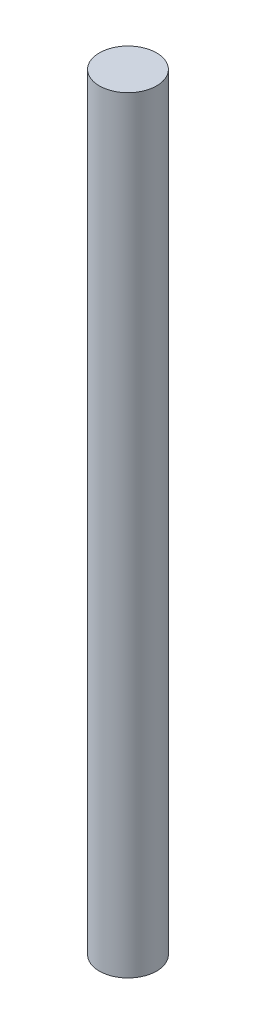
ISO-10303-21;
HEADER;
FILE_DESCRIPTION(('STEP AP214'),'2;1');
FILE_NAME('part.step','',(''),(''),'','','');
FILE_SCHEMA(('AUTOMOTIVE_DESIGN { 1 0 10303 214 1 1 1 1 }'));
ENDSEC;
DATA;
#1=APPLICATION_CONTEXT('core data for automotive mechanical design processes');
#2=APPLICATION_PROTOCOL_DEFINITION('international standard','automotive_design',2000,#1);
#3=PRODUCT_CONTEXT('',#1,'mechanical');
#4=PRODUCT('Part','Part','',(#3));
#5=PRODUCT_RELATED_PRODUCT_CATEGORY('part','',(#4));
#6=PRODUCT_DEFINITION_FORMATION('','',#4);
#7=PRODUCT_DEFINITION_CONTEXT('part definition',#1,'design');
#8=PRODUCT_DEFINITION('design','',#6,#7);
#9=PRODUCT_DEFINITION_SHAPE('','',#8);
#10=(LENGTH_UNIT() NAMED_UNIT(*) SI_UNIT(.MILLI.,.METRE.));
#11=(NAMED_UNIT(*) PLANE_ANGLE_UNIT() SI_UNIT($,.RADIAN.));
#12=(NAMED_UNIT(*) SI_UNIT($,.STERADIAN.) SOLID_ANGLE_UNIT());
#13=UNCERTAINTY_MEASURE_WITH_UNIT(LENGTH_MEASURE(1.E-05),#10,'distance_accuracy_value','');
#14=(GEOMETRIC_REPRESENTATION_CONTEXT(3) GLOBAL_UNCERTAINTY_ASSIGNED_CONTEXT((#13)) GLOBAL_UNIT_ASSIGNED_CONTEXT((#10,
#11,#12)) REPRESENTATION_CONTEXT('',''));
#15=CARTESIAN_POINT('',(0.,0.,0.));
#16=DIRECTION('',(0.,0.,1.));
#17=DIRECTION('',(1.,0.,0.));
#18=AXIS2_PLACEMENT_3D('',#15,#16,#17);
#19=CARTESIAN_POINT('',(0.,85.09,0.));
#20=DIRECTION('',(0.,-1.,0.));
#21=DIRECTION('',(0.,0.,-1.));
#22=AXIS2_PLACEMENT_3D('',#19,#20,#21);
#23=CYLINDRICAL_SURFACE('',#22,3.175);
#24=CARTESIAN_POINT('',(0.,85.09,0.));
#25=DIRECTION('',(0.,1.,0.));
#26=DIRECTION('',(0.,0.,1.));
#27=AXIS2_PLACEMENT_3D('',#24,#25,#26);
#28=CIRCLE('',#27,3.175);
#29=CARTESIAN_POINT('',(0.,85.09,3.175));
#30=VERTEX_POINT('',#29);
#31=EDGE_CURVE('E10',#30,#30,#28,.T.);
#32=ORIENTED_EDGE('',*,*,#31,.F.);
#33=EDGE_LOOP('',(#32));
#34=FACE_BOUND('',#33,.T.);
#35=CARTESIAN_POINT('',(0.,0.,0.));
#36=DIRECTION('',(0.,1.,0.));
#37=DIRECTION('',(0.,0.,1.));
#38=AXIS2_PLACEMENT_3D('',#35,#36,#37);
#39=CIRCLE('',#38,3.175);
#40=CARTESIAN_POINT('',(0.,0.,3.175));
#41=VERTEX_POINT('',#40);
#42=EDGE_CURVE('E42',#41,#41,#39,.T.);
#43=ORIENTED_EDGE('',*,*,#42,.T.);
#44=EDGE_LOOP('',(#43));
#45=FACE_BOUND('',#44,.T.);
#46=ADVANCED_FACE('F39',(#34,#45),#23,.T.);
#47=CARTESIAN_POINT('',(0.,85.09,0.));
#48=DIRECTION('',(0.,1.,0.));
#49=DIRECTION('',(0.,0.,1.));
#50=AXIS2_PLACEMENT_3D('',#47,#48,#49);
#51=PLANE('',#50);
#52=ORIENTED_EDGE('',*,*,#31,.T.);
#53=EDGE_LOOP('',(#52));
#54=FACE_BOUND('',#53,.T.);
#55=ADVANCED_FACE('F54',(#54),#51,.T.);
#56=CARTESIAN_POINT('',(0.,0.,0.));
#57=DIRECTION('',(0.,1.,0.));
#58=DIRECTION('',(0.,0.,1.));
#59=AXIS2_PLACEMENT_3D('',#56,#57,#58);
#60=PLANE('',#59);
#61=ORIENTED_EDGE('',*,*,#42,.F.);
#62=EDGE_LOOP('',(#61));
#63=FACE_BOUND('',#62,.T.);
#64=ADVANCED_FACE('F52',(#63),#60,.F.);
#65=CLOSED_SHELL('',(#46,#55,#64));
#66=MANIFOLD_SOLID_BREP('B2',#65);
#67=ADVANCED_BREP_SHAPE_REPRESENTATION('',(#18,#66),#14);
#68=SHAPE_DEFINITION_REPRESENTATION(#9,#67);
ENDSEC;
END-ISO-10303-21;
